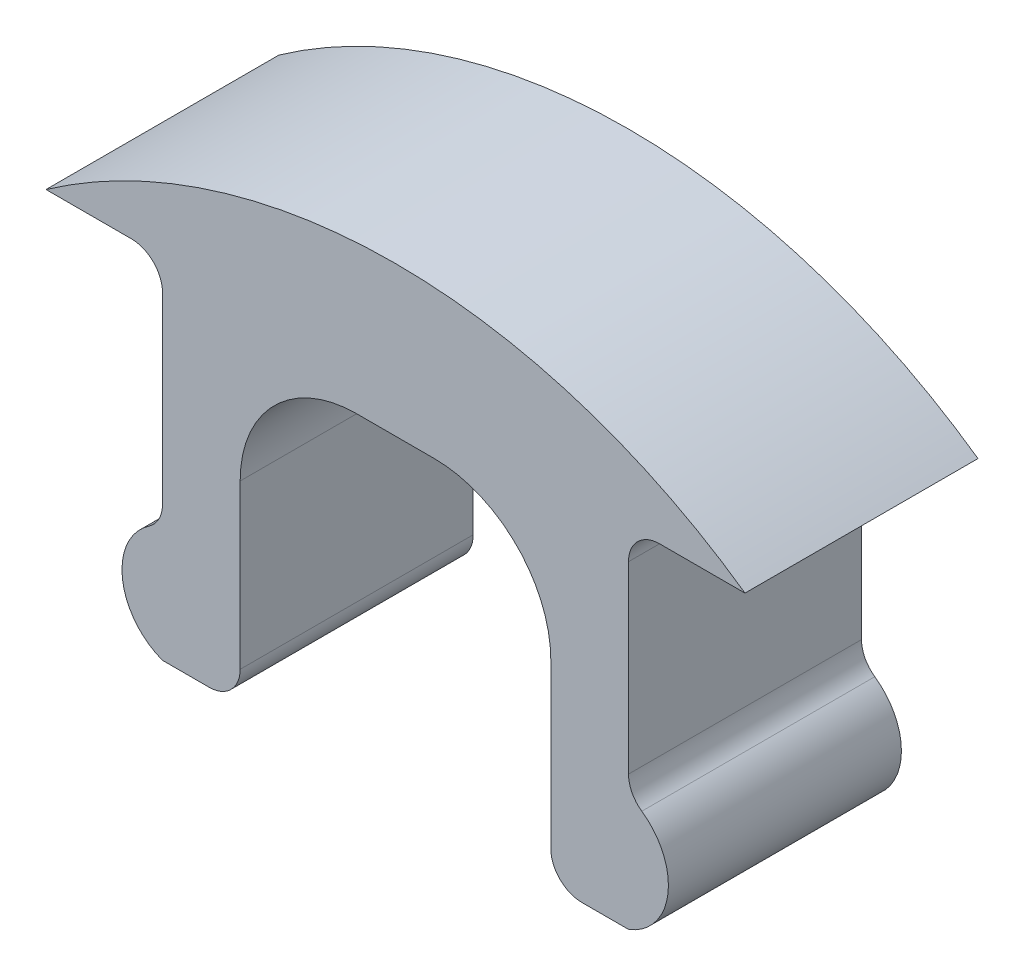
ISO-10303-21;
HEADER;
FILE_DESCRIPTION(('STEP AP214'),'2;1');
FILE_NAME('part.step','',(''),(''),'','','');
FILE_SCHEMA(('AUTOMOTIVE_DESIGN { 1 0 10303 214 1 1 1 1 }'));
ENDSEC;
DATA;
#1=APPLICATION_CONTEXT('core data for automotive mechanical design processes');
#2=APPLICATION_PROTOCOL_DEFINITION('international standard','automotive_design',2000,#1);
#3=PRODUCT_CONTEXT('',#1,'mechanical');
#4=PRODUCT('Part','Part','',(#3));
#5=PRODUCT_RELATED_PRODUCT_CATEGORY('part','',(#4));
#6=PRODUCT_DEFINITION_FORMATION('','',#4);
#7=PRODUCT_DEFINITION_CONTEXT('part definition',#1,'design');
#8=PRODUCT_DEFINITION('design','',#6,#7);
#9=PRODUCT_DEFINITION_SHAPE('','',#8);
#10=(LENGTH_UNIT() NAMED_UNIT(*) SI_UNIT(.MILLI.,.METRE.));
#11=(NAMED_UNIT(*) PLANE_ANGLE_UNIT() SI_UNIT($,.RADIAN.));
#12=(NAMED_UNIT(*) SI_UNIT($,.STERADIAN.) SOLID_ANGLE_UNIT());
#13=UNCERTAINTY_MEASURE_WITH_UNIT(LENGTH_MEASURE(1.E-05),#10,'distance_accuracy_value','');
#14=(GEOMETRIC_REPRESENTATION_CONTEXT(3) GLOBAL_UNCERTAINTY_ASSIGNED_CONTEXT((#13)) GLOBAL_UNIT_ASSIGNED_CONTEXT((#10,
#11,#12)) REPRESENTATION_CONTEXT('',''));
#15=CARTESIAN_POINT('',(0.,0.,0.));
#16=DIRECTION('',(0.,0.,1.));
#17=DIRECTION('',(1.,0.,0.));
#18=AXIS2_PLACEMENT_3D('',#15,#16,#17);
#19=CARTESIAN_POINT('',(0.278388218141501,-0.75,3.));
#20=DIRECTION('',(0.,0.,-1.));
#21=DIRECTION('',(-1.,0.,0.));
#22=AXIS2_PLACEMENT_3D('',#19,#20,#21);
#23=CYLINDRICAL_SURFACE('',#22,0.8);
#24=CARTESIAN_POINT('',(0.278388218141501,-0.75,3.));
#25=DIRECTION('',(0.,0.,1.));
#26=DIRECTION('',(-1.,0.,0.));
#27=AXIS2_PLACEMENT_3D('',#24,#25,#26);
#28=CIRCLE('',#27,0.8);
#29=CARTESIAN_POINT('',(-0.173870593952833,-0.0901045788285679,3.));
#30=VERTEX_POINT('',#29);
#31=CARTESIAN_POINT('',(0.,-1.5,3.));
#32=VERTEX_POINT('',#31);
#33=EDGE_CURVE('E177',#30,#32,#28,.T.);
#34=ORIENTED_EDGE('',*,*,#33,.F.);
#35=DIRECTION('',(0.,0.,-1.));
#36=VECTOR('',#35,1.);
#37=CARTESIAN_POINT('',(-0.173870593952833,-0.0901045788285678,3.));
#38=LINE('',#37,#36);
#39=CARTESIAN_POINT('',(-0.173870593952833,-0.0901045788285679,0.));
#40=VERTEX_POINT('',#39);
#41=EDGE_CURVE('E241',#30,#40,#38,.T.);
#42=ORIENTED_EDGE('',*,*,#41,.T.);
#43=CARTESIAN_POINT('',(0.278388218141501,-0.75,0.));
#44=DIRECTION('',(0.,0.,1.));
#45=DIRECTION('',(-1.,0.,0.));
#46=AXIS2_PLACEMENT_3D('',#43,#44,#45);
#47=CIRCLE('',#46,0.8);
#48=CARTESIAN_POINT('',(0.,-1.5,0.));
#49=VERTEX_POINT('',#48);
#50=EDGE_CURVE('E203',#40,#49,#47,.T.);
#51=ORIENTED_EDGE('',*,*,#50,.T.);
#52=DIRECTION('',(0.,0.,-1.));
#53=VECTOR('',#52,1.);
#54=CARTESIAN_POINT('',(0.,-1.5,3.));
#55=LINE('',#54,#53);
#56=EDGE_CURVE('E196',#32,#49,#55,.T.);
#57=ORIENTED_EDGE('',*,*,#56,.F.);
#58=EDGE_LOOP('',(#34,#42,#51,#57));
#59=FACE_BOUND('',#58,.T.);
#60=ADVANCED_FACE('F39',(#59),#23,.T.);
#61=CARTESIAN_POINT('',(0.,-1.5,3.));
#62=DIRECTION('',(0.,1.,0.));
#63=DIRECTION('',(0.,0.,1.));
#64=AXIS2_PLACEMENT_3D('',#61,#62,#63);
#65=PLANE('',#64);
#66=DIRECTION('',(1.,0.,0.));
#67=VECTOR('',#66,1.);
#68=CARTESIAN_POINT('',(0.,-1.5,0.));
#69=LINE('',#68,#67);
#70=CARTESIAN_POINT('',(0.6,-1.5,0.));
#71=VERTEX_POINT('',#70);
#72=EDGE_CURVE('E342',#49,#71,#69,.T.);
#73=ORIENTED_EDGE('',*,*,#72,.T.);
#74=DIRECTION('',(0.,0.,-1.));
#75=VECTOR('',#74,1.);
#76=CARTESIAN_POINT('',(0.6,-1.5,3.));
#77=LINE('',#76,#75);
#78=CARTESIAN_POINT('',(0.6,-1.5,3.));
#79=VERTEX_POINT('',#78);
#80=EDGE_CURVE('E198',#71,#79,#77,.F.);
#81=ORIENTED_EDGE('',*,*,#80,.T.);
#82=DIRECTION('',(1.,0.,0.));
#83=VECTOR('',#82,1.);
#84=CARTESIAN_POINT('',(0.,-1.5,3.));
#85=LINE('',#84,#83);
#86=EDGE_CURVE('E180',#32,#79,#85,.T.);
#87=ORIENTED_EDGE('',*,*,#86,.F.);
#88=ORIENTED_EDGE('',*,*,#56,.T.);
#89=EDGE_LOOP('',(#73,#81,#87,#88));
#90=FACE_BOUND('',#89,.T.);
#91=ADVANCED_FACE('F195',(#90),#65,.F.);
#92=CARTESIAN_POINT('',(1.,-1.5,3.));
#93=DIRECTION('',(-1.,0.,0.));
#94=DIRECTION('',(0.,0.,1.));
#95=AXIS2_PLACEMENT_3D('',#92,#93,#94);
#96=PLANE('',#95);
#97=DIRECTION('',(0.,1.,0.));
#98=VECTOR('',#97,1.);
#99=CARTESIAN_POINT('',(1.,-1.5,0.));
#100=LINE('',#99,#98);
#101=CARTESIAN_POINT('',(1.,-1.1,0.));
#102=VERTEX_POINT('',#101);
#103=CARTESIAN_POINT('',(1.,1.,0.));
#104=VERTEX_POINT('',#103);
#105=EDGE_CURVE('E336',#102,#104,#100,.T.);
#106=ORIENTED_EDGE('',*,*,#105,.T.);
#107=DIRECTION('',(0.,0.,-1.));
#108=VECTOR('',#107,1.);
#109=CARTESIAN_POINT('',(1.,1.,3.));
#110=LINE('',#109,#108);
#111=CARTESIAN_POINT('',(1.,1.,3.));
#112=VERTEX_POINT('',#111);
#113=EDGE_CURVE('E61',#104,#112,#110,.F.);
#114=ORIENTED_EDGE('',*,*,#113,.T.);
#115=DIRECTION('',(0.,1.,0.));
#116=VECTOR('',#115,1.);
#117=CARTESIAN_POINT('',(1.,-1.5,3.));
#118=LINE('',#117,#116);
#119=CARTESIAN_POINT('',(1.,-1.1,3.));
#120=VERTEX_POINT('',#119);
#121=EDGE_CURVE('E200',#120,#112,#118,.T.);
#122=ORIENTED_EDGE('',*,*,#121,.F.);
#123=DIRECTION('',(0.,0.,-1.));
#124=VECTOR('',#123,1.);
#125=CARTESIAN_POINT('',(1.,-1.1,3.));
#126=LINE('',#125,#124);
#127=EDGE_CURVE('E206',#120,#102,#126,.T.);
#128=ORIENTED_EDGE('',*,*,#127,.T.);
#129=EDGE_LOOP('',(#106,#114,#122,#128));
#130=FACE_BOUND('',#129,.T.);
#131=ADVANCED_FACE('F413',(#130),#96,.F.);
#132=CARTESIAN_POINT('',(1.,2.5,3.));
#133=DIRECTION('',(0.,1.,0.));
#134=DIRECTION('',(0.,0.,1.));
#135=AXIS2_PLACEMENT_3D('',#132,#133,#134);
#136=PLANE('',#135);
#137=DIRECTION('',(1.,0.,0.));
#138=VECTOR('',#137,1.);
#139=CARTESIAN_POINT('',(1.,2.5,0.));
#140=LINE('',#139,#138);
#141=CARTESIAN_POINT('',(2.5,2.5,0.));
#142=VERTEX_POINT('',#141);
#143=CARTESIAN_POINT('',(3.5,2.5,0.));
#144=VERTEX_POINT('',#143);
#145=EDGE_CURVE('E330',#142,#144,#140,.T.);
#146=ORIENTED_EDGE('',*,*,#145,.T.);
#147=DIRECTION('',(0.,0.,-1.));
#148=VECTOR('',#147,1.);
#149=CARTESIAN_POINT('',(3.5,2.5,3.));
#150=LINE('',#149,#148);
#151=CARTESIAN_POINT('',(3.5,2.5,3.));
#152=VERTEX_POINT('',#151);
#153=EDGE_CURVE('E299',#144,#152,#150,.F.);
#154=ORIENTED_EDGE('',*,*,#153,.T.);
#155=DIRECTION('',(1.,0.,0.));
#156=VECTOR('',#155,1.);
#157=CARTESIAN_POINT('',(1.,2.5,3.));
#158=LINE('',#157,#156);
#159=CARTESIAN_POINT('',(2.5,2.5,3.));
#160=VERTEX_POINT('',#159);
#161=EDGE_CURVE('E315',#160,#152,#158,.T.);
#162=ORIENTED_EDGE('',*,*,#161,.F.);
#163=DIRECTION('',(0.,0.,-1.));
#164=VECTOR('',#163,1.);
#165=CARTESIAN_POINT('',(2.5,2.5,0.));
#166=LINE('',#165,#164);
#167=EDGE_CURVE('E295',#160,#142,#166,.T.);
#168=ORIENTED_EDGE('',*,*,#167,.T.);
#169=EDGE_LOOP('',(#146,#154,#162,#168));
#170=FACE_BOUND('',#169,.T.);
#171=ADVANCED_FACE('F333',(#170),#136,.F.);
#172=CARTESIAN_POINT('',(5.,2.5,3.));
#173=DIRECTION('',(1.,0.,0.));
#174=DIRECTION('',(0.,0.,-1.));
#175=AXIS2_PLACEMENT_3D('',#172,#173,#174);
#176=PLANE('',#175);
#177=DIRECTION('',(0.,-1.,0.));
#178=VECTOR('',#177,1.);
#179=CARTESIAN_POINT('',(5.,2.5,3.));
#180=LINE('',#179,#178);
#181=CARTESIAN_POINT('',(5.,1.,3.));
#182=VERTEX_POINT('',#181);
#183=CARTESIAN_POINT('',(5.,-1.1,3.));
#184=VERTEX_POINT('',#183);
#185=EDGE_CURVE('E313',#182,#184,#180,.T.);
#186=ORIENTED_EDGE('',*,*,#185,.F.);
#187=DIRECTION('',(0.,0.,-1.));
#188=VECTOR('',#187,1.);
#189=CARTESIAN_POINT('',(5.,1.,0.));
#190=LINE('',#189,#188);
#191=CARTESIAN_POINT('',(5.,1.,0.));
#192=VERTEX_POINT('',#191);
#193=EDGE_CURVE('E291',#182,#192,#190,.T.);
#194=ORIENTED_EDGE('',*,*,#193,.T.);
#195=DIRECTION('',(0.,-1.,0.));
#196=VECTOR('',#195,1.);
#197=CARTESIAN_POINT('',(5.,2.5,0.));
#198=LINE('',#197,#196);
#199=CARTESIAN_POINT('',(5.,-1.1,0.));
#200=VERTEX_POINT('',#199);
#201=EDGE_CURVE('E331',#192,#200,#198,.T.);
#202=ORIENTED_EDGE('',*,*,#201,.T.);
#203=DIRECTION('',(0.,0.,-1.));
#204=VECTOR('',#203,1.);
#205=CARTESIAN_POINT('',(5.,-1.1,3.));
#206=LINE('',#205,#204);
#207=EDGE_CURVE('E237',#200,#184,#206,.F.);
#208=ORIENTED_EDGE('',*,*,#207,.T.);
#209=EDGE_LOOP('',(#186,#194,#202,#208));
#210=FACE_BOUND('',#209,.T.);
#211=ADVANCED_FACE('F320',(#210),#176,.F.);
#212=CARTESIAN_POINT('',(5.,-1.5,3.));
#213=DIRECTION('',(0.,1.,0.));
#214=DIRECTION('',(0.,0.,1.));
#215=AXIS2_PLACEMENT_3D('',#212,#213,#214);
#216=PLANE('',#215);
#217=DIRECTION('',(1.,0.,0.));
#218=VECTOR('',#217,1.);
#219=CARTESIAN_POINT('',(5.,-1.5,3.));
#220=LINE('',#219,#218);
#221=CARTESIAN_POINT('',(5.4,-1.5,3.));
#222=VERTEX_POINT('',#221);
#223=CARTESIAN_POINT('',(6.,-1.5,3.));
#224=VERTEX_POINT('',#223);
#225=EDGE_CURVE('E325',#222,#224,#220,.T.);
#226=ORIENTED_EDGE('',*,*,#225,.F.);
#227=DIRECTION('',(0.,0.,-1.));
#228=VECTOR('',#227,1.);
#229=CARTESIAN_POINT('',(5.4,-1.5,3.));
#230=LINE('',#229,#228);
#231=CARTESIAN_POINT('',(5.4,-1.5,0.));
#232=VERTEX_POINT('',#231);
#233=EDGE_CURVE('E233',#222,#232,#230,.T.);
#234=ORIENTED_EDGE('',*,*,#233,.T.);
#235=DIRECTION('',(1.,0.,0.));
#236=VECTOR('',#235,1.);
#237=CARTESIAN_POINT('',(5.,-1.5,0.));
#238=LINE('',#237,#236);
#239=CARTESIAN_POINT('',(6.,-1.5,0.));
#240=VERTEX_POINT('',#239);
#241=EDGE_CURVE('E340',#232,#240,#238,.T.);
#242=ORIENTED_EDGE('',*,*,#241,.T.);
#243=DIRECTION('',(0.,0.,-1.));
#244=VECTOR('',#243,1.);
#245=CARTESIAN_POINT('',(6.,-1.5,3.));
#246=LINE('',#245,#244);
#247=EDGE_CURVE('E207',#224,#240,#246,.T.);
#248=ORIENTED_EDGE('',*,*,#247,.F.);
#249=EDGE_LOOP('',(#226,#234,#242,#248));
#250=FACE_BOUND('',#249,.T.);
#251=ADVANCED_FACE('F455',(#250),#216,.F.);
#252=CARTESIAN_POINT('',(5.71378692896109,-0.75295108729985,3.));
#253=DIRECTION('',(0.,0.,-1.));
#254=DIRECTION('',(-1.,0.,0.));
#255=AXIS2_PLACEMENT_3D('',#252,#253,#254);
#256=CYLINDRICAL_SURFACE('',#255,0.8);
#257=CARTESIAN_POINT('',(5.71378692896109,-0.75295108729985,0.));
#258=DIRECTION('',(0.,0.,1.));
#259=DIRECTION('',(-1.,0.,0.));
#260=AXIS2_PLACEMENT_3D('',#257,#258,#259);
#261=CIRCLE('',#260,0.8);
#262=CARTESIAN_POINT('',(6.1712623096537,-0.0966613067454398,0.));
#263=VERTEX_POINT('',#262);
#264=EDGE_CURVE('E348',#240,#263,#261,.T.);
#265=ORIENTED_EDGE('',*,*,#264,.T.);
#266=DIRECTION('',(0.,0.,-1.));
#267=VECTOR('',#266,1.);
#268=CARTESIAN_POINT('',(6.1712623096537,-0.0966613067454398,3.));
#269=LINE('',#268,#267);
#270=CARTESIAN_POINT('',(6.1712623096537,-0.0966613067454398,3.));
#271=VERTEX_POINT('',#270);
#272=EDGE_CURVE('E258',#263,#271,#269,.F.);
#273=ORIENTED_EDGE('',*,*,#272,.T.);
#274=CARTESIAN_POINT('',(5.71378692896109,-0.75295108729985,3.));
#275=DIRECTION('',(0.,0.,1.));
#276=DIRECTION('',(-1.,0.,0.));
#277=AXIS2_PLACEMENT_3D('',#274,#275,#276);
#278=CIRCLE('',#277,0.8);
#279=EDGE_CURVE('E421',#224,#271,#278,.T.);
#280=ORIENTED_EDGE('',*,*,#279,.F.);
#281=ORIENTED_EDGE('',*,*,#247,.T.);
#282=EDGE_LOOP('',(#265,#273,#280,#281));
#283=FACE_BOUND('',#282,.T.);
#284=ADVANCED_FACE('F450',(#283),#256,.T.);
#285=CARTESIAN_POINT('',(6.,-0.00590217459969908,3.));
#286=DIRECTION('',(-1.,0.,0.));
#287=DIRECTION('',(0.,0.,1.));
#288=AXIS2_PLACEMENT_3D('',#285,#286,#287);
#289=PLANE('',#288);
#290=DIRECTION('',(0.,1.,0.));
#291=VECTOR('',#290,1.);
#292=CARTESIAN_POINT('',(6.,-0.00590217459969908,3.));
#293=LINE('',#292,#291);
#294=CARTESIAN_POINT('',(6.,0.231483583531765,3.));
#295=VERTEX_POINT('',#294);
#296=CARTESIAN_POINT('',(6.,2.6,3.));
#297=VERTEX_POINT('',#296);
#298=EDGE_CURVE('E425',#295,#297,#293,.T.);
#299=ORIENTED_EDGE('',*,*,#298,.F.);
#300=DIRECTION('',(0.,0.,1.));
#301=VECTOR('',#300,1.);
#302=CARTESIAN_POINT('',(6.,0.231483583531765,0.));
#303=LINE('',#302,#301);
#304=CARTESIAN_POINT('',(6.,0.231483583531765,0.));
#305=VERTEX_POINT('',#304);
#306=EDGE_CURVE('E254',#295,#305,#303,.F.);
#307=ORIENTED_EDGE('',*,*,#306,.T.);
#308=DIRECTION('',(0.,1.,0.));
#309=VECTOR('',#308,1.);
#310=CARTESIAN_POINT('',(6.,-0.00590217459969908,0.));
#311=LINE('',#310,#309);
#312=CARTESIAN_POINT('',(6.,2.6,0.));
#313=VERTEX_POINT('',#312);
#314=EDGE_CURVE('E352',#305,#313,#311,.T.);
#315=ORIENTED_EDGE('',*,*,#314,.T.);
#316=DIRECTION('',(0.,0.,-1.));
#317=VECTOR('',#316,1.);
#318=CARTESIAN_POINT('',(6.,2.6,3.));
#319=LINE('',#318,#317);
#320=EDGE_CURVE('E251',#313,#297,#319,.F.);
#321=ORIENTED_EDGE('',*,*,#320,.T.);
#322=EDGE_LOOP('',(#299,#307,#315,#321));
#323=FACE_BOUND('',#322,.T.);
#324=ADVANCED_FACE('F441',(#323),#289,.F.);
#325=CARTESIAN_POINT('',(6.,3.,3.));
#326=DIRECTION('',(0.,1.,0.));
#327=DIRECTION('',(0.,0.,1.));
#328=AXIS2_PLACEMENT_3D('',#325,#326,#327);
#329=PLANE('',#328);
#330=DIRECTION('',(1.,0.,0.));
#331=VECTOR('',#330,1.);
#332=CARTESIAN_POINT('',(6.,3.,3.));
#333=LINE('',#332,#331);
#334=CARTESIAN_POINT('',(6.4,3.,3.));
#335=VERTEX_POINT('',#334);
#336=CARTESIAN_POINT('',(7.5,3.,3.));
#337=VERTEX_POINT('',#336);
#338=EDGE_CURVE('E429',#335,#337,#333,.T.);
#339=ORIENTED_EDGE('',*,*,#338,.F.);
#340=DIRECTION('',(0.,0.,-1.));
#341=VECTOR('',#340,1.);
#342=CARTESIAN_POINT('',(6.4,3.,0.));
#343=LINE('',#342,#341);
#344=CARTESIAN_POINT('',(6.4,3.,0.));
#345=VERTEX_POINT('',#344);
#346=EDGE_CURVE('E261',#335,#345,#343,.T.);
#347=ORIENTED_EDGE('',*,*,#346,.T.);
#348=DIRECTION('',(1.,0.,0.));
#349=VECTOR('',#348,1.);
#350=CARTESIAN_POINT('',(6.,3.,0.));
#351=LINE('',#350,#349);
#352=CARTESIAN_POINT('',(7.5,3.,0.));
#353=VERTEX_POINT('',#352);
#354=EDGE_CURVE('E356',#345,#353,#351,.T.);
#355=ORIENTED_EDGE('',*,*,#354,.T.);
#356=DIRECTION('',(0.,0.,-1.));
#357=VECTOR('',#356,1.);
#358=CARTESIAN_POINT('',(7.5,3.,3.));
#359=LINE('',#358,#357);
#360=EDGE_CURVE('E215',#337,#353,#359,.T.);
#361=ORIENTED_EDGE('',*,*,#360,.F.);
#362=EDGE_LOOP('',(#339,#347,#355,#361));
#363=FACE_BOUND('',#362,.T.);
#364=ADVANCED_FACE('F434',(#363),#329,.F.);
#365=CARTESIAN_POINT('',(3.,-3.3916889074762,3.));
#366=DIRECTION('',(0.,0.,-1.));
#367=DIRECTION('',(-1.,0.,0.));
#368=AXIS2_PLACEMENT_3D('',#365,#366,#367);
#369=CYLINDRICAL_SURFACE('',#368,7.81688474329476);
#370=CARTESIAN_POINT('',(3.,-3.3916889074762,0.));
#371=DIRECTION('',(0.,0.,1.));
#372=DIRECTION('',(-1.,0.,0.));
#373=AXIS2_PLACEMENT_3D('',#370,#371,#372);
#374=CIRCLE('',#373,7.81688474329476);
#375=CARTESIAN_POINT('',(-1.5,3.,0.));
#376=VERTEX_POINT('',#375);
#377=EDGE_CURVE('E359',#353,#376,#374,.T.);
#378=ORIENTED_EDGE('',*,*,#377,.T.);
#379=DIRECTION('',(0.,0.,-1.));
#380=VECTOR('',#379,1.);
#381=CARTESIAN_POINT('',(-1.5,3.,3.));
#382=LINE('',#381,#380);
#383=CARTESIAN_POINT('',(-1.5,3.,3.));
#384=VERTEX_POINT('',#383);
#385=EDGE_CURVE('E369',#384,#376,#382,.T.);
#386=ORIENTED_EDGE('',*,*,#385,.F.);
#387=CARTESIAN_POINT('',(3.,-3.3916889074762,3.));
#388=DIRECTION('',(0.,0.,1.));
#389=DIRECTION('',(-1.,0.,0.));
#390=AXIS2_PLACEMENT_3D('',#387,#388,#389);
#391=CIRCLE('',#390,7.81688474329476);
#392=EDGE_CURVE('E381',#337,#384,#391,.T.);
#393=ORIENTED_EDGE('',*,*,#392,.F.);
#394=ORIENTED_EDGE('',*,*,#360,.T.);
#395=EDGE_LOOP('',(#378,#386,#393,#394));
#396=FACE_BOUND('',#395,.T.);
#397=ADVANCED_FACE('F379',(#396),#369,.T.);
#398=CARTESIAN_POINT('',(0.,3.,3.));
#399=DIRECTION('',(0.,1.,0.));
#400=DIRECTION('',(0.,0.,1.));
#401=AXIS2_PLACEMENT_3D('',#398,#399,#400);
#402=PLANE('',#401);
#403=DIRECTION('',(1.,0.,0.));
#404=VECTOR('',#403,1.);
#405=CARTESIAN_POINT('',(0.,3.,0.));
#406=LINE('',#405,#404);
#407=CARTESIAN_POINT('',(-0.4,3.,0.));
#408=VERTEX_POINT('',#407);
#409=EDGE_CURVE('E362',#376,#408,#406,.T.);
#410=ORIENTED_EDGE('',*,*,#409,.T.);
#411=DIRECTION('',(0.,0.,-1.));
#412=VECTOR('',#411,1.);
#413=CARTESIAN_POINT('',(-0.4,3.,3.));
#414=LINE('',#413,#412);
#415=CARTESIAN_POINT('',(-0.4,3.,3.));
#416=VERTEX_POINT('',#415);
#417=EDGE_CURVE('E265',#408,#416,#414,.F.);
#418=ORIENTED_EDGE('',*,*,#417,.T.);
#419=DIRECTION('',(1.,0.,0.));
#420=VECTOR('',#419,1.);
#421=CARTESIAN_POINT('',(0.,3.,3.));
#422=LINE('',#421,#420);
#423=EDGE_CURVE('E397',#384,#416,#422,.T.);
#424=ORIENTED_EDGE('',*,*,#423,.F.);
#425=ORIENTED_EDGE('',*,*,#385,.T.);
#426=EDGE_LOOP('',(#410,#418,#424,#425));
#427=FACE_BOUND('',#426,.T.);
#428=ADVANCED_FACE('F389',(#427),#402,.F.);
#429=CARTESIAN_POINT('',(0.,0.,3.));
#430=DIRECTION('',(1.,0.,0.));
#431=DIRECTION('',(0.,0.,-1.));
#432=AXIS2_PLACEMENT_3D('',#429,#430,#431);
#433=PLANE('',#432);
#434=DIRECTION('',(0.,-1.,0.));
#435=VECTOR('',#434,1.);
#436=CARTESIAN_POINT('',(0.,0.,0.));
#437=LINE('',#436,#435);
#438=CARTESIAN_POINT('',(0.,2.6,0.));
#439=VERTEX_POINT('',#438);
#440=CARTESIAN_POINT('',(0.,0.239843131757148,0.));
#441=VERTEX_POINT('',#440);
#442=EDGE_CURVE('E190',#439,#441,#437,.T.);
#443=ORIENTED_EDGE('',*,*,#442,.T.);
#444=DIRECTION('',(0.,0.,1.));
#445=VECTOR('',#444,1.);
#446=CARTESIAN_POINT('',(0.,0.239843131757148,3.));
#447=LINE('',#446,#445);
#448=CARTESIAN_POINT('',(0.,0.239843131757148,3.));
#449=VERTEX_POINT('',#448);
#450=EDGE_CURVE('E248',#441,#449,#447,.T.);
#451=ORIENTED_EDGE('',*,*,#450,.T.);
#452=DIRECTION('',(0.,-1.,0.));
#453=VECTOR('',#452,1.);
#454=CARTESIAN_POINT('',(0.,0.,3.));
#455=LINE('',#454,#453);
#456=CARTESIAN_POINT('',(0.,2.6,3.));
#457=VERTEX_POINT('',#456);
#458=EDGE_CURVE('E372',#457,#449,#455,.T.);
#459=ORIENTED_EDGE('',*,*,#458,.F.);
#460=DIRECTION('',(0.,0.,-1.));
#461=VECTOR('',#460,1.);
#462=CARTESIAN_POINT('',(0.,2.6,0.));
#463=LINE('',#462,#461);
#464=EDGE_CURVE('E244',#457,#439,#463,.T.);
#465=ORIENTED_EDGE('',*,*,#464,.T.);
#466=EDGE_LOOP('',(#443,#451,#459,#465));
#467=FACE_BOUND('',#466,.T.);
#468=ADVANCED_FACE('F399',(#467),#433,.F.);
#469=CARTESIAN_POINT('',(0.278388218141501,-0.75,3.));
#470=DIRECTION('',(0.,0.,-1.));
#471=DIRECTION('',(-1.,0.,0.));
#472=AXIS2_PLACEMENT_3D('',#469,#470,#471);
#473=PLANE('',#472);
#474=ORIENTED_EDGE('',*,*,#86,.T.);
#475=CARTESIAN_POINT('',(0.6,-1.1,3.));
#476=DIRECTION('',(0.,0.,-1.));
#477=DIRECTION('',(-1.,0.,0.));
#478=AXIS2_PLACEMENT_3D('',#475,#476,#477);
#479=CIRCLE('',#478,0.4);
#480=EDGE_CURVE('E230',#79,#120,#479,.F.);
#481=ORIENTED_EDGE('',*,*,#480,.T.);
#482=ORIENTED_EDGE('',*,*,#121,.T.);
#483=CARTESIAN_POINT('',(2.5,1.,3.));
#484=DIRECTION('',(0.,0.,-1.));
#485=DIRECTION('',(-1.,0.,0.));
#486=AXIS2_PLACEMENT_3D('',#483,#484,#485);
#487=CIRCLE('',#486,1.5);
#488=EDGE_CURVE('E11',#112,#160,#487,.T.);
#489=ORIENTED_EDGE('',*,*,#488,.T.);
#490=ORIENTED_EDGE('',*,*,#161,.T.);
#491=CARTESIAN_POINT('',(3.5,1.,3.));
#492=DIRECTION('',(0.,0.,-1.));
#493=DIRECTION('',(-1.,0.,0.));
#494=AXIS2_PLACEMENT_3D('',#491,#492,#493);
#495=CIRCLE('',#494,1.5);
#496=EDGE_CURVE('E307',#152,#182,#495,.T.);
#497=ORIENTED_EDGE('',*,*,#496,.T.);
#498=ORIENTED_EDGE('',*,*,#185,.T.);
#499=CARTESIAN_POINT('',(5.4,-1.1,3.));
#500=DIRECTION('',(0.,0.,-1.));
#501=DIRECTION('',(-1.,0.,0.));
#502=AXIS2_PLACEMENT_3D('',#499,#500,#501);
#503=CIRCLE('',#502,0.4);
#504=EDGE_CURVE('E227',#184,#222,#503,.F.);
#505=ORIENTED_EDGE('',*,*,#504,.T.);
#506=ORIENTED_EDGE('',*,*,#225,.T.);
#507=ORIENTED_EDGE('',*,*,#279,.T.);
#508=CARTESIAN_POINT('',(6.4,0.231483583531765,3.));
#509=DIRECTION('',(0.,0.,-1.));
#510=DIRECTION('',(-1.,0.,0.));
#511=AXIS2_PLACEMENT_3D('',#508,#509,#510);
#512=CIRCLE('',#511,0.4);
#513=EDGE_CURVE('E276',#271,#295,#512,.T.);
#514=ORIENTED_EDGE('',*,*,#513,.T.);
#515=ORIENTED_EDGE('',*,*,#298,.T.);
#516=CARTESIAN_POINT('',(6.4,2.6,3.));
#517=DIRECTION('',(0.,0.,-1.));
#518=DIRECTION('',(-1.,0.,0.));
#519=AXIS2_PLACEMENT_3D('',#516,#517,#518);
#520=CIRCLE('',#519,0.4);
#521=EDGE_CURVE('E282',#297,#335,#520,.T.);
#522=ORIENTED_EDGE('',*,*,#521,.T.);
#523=ORIENTED_EDGE('',*,*,#338,.T.);
#524=ORIENTED_EDGE('',*,*,#392,.T.);
#525=ORIENTED_EDGE('',*,*,#423,.T.);
#526=CARTESIAN_POINT('',(-0.4,2.6,3.));
#527=DIRECTION('',(0.,0.,-1.));
#528=DIRECTION('',(-1.,0.,0.));
#529=AXIS2_PLACEMENT_3D('',#526,#527,#528);
#530=CIRCLE('',#529,0.4);
#531=EDGE_CURVE('E288',#416,#457,#530,.T.);
#532=ORIENTED_EDGE('',*,*,#531,.T.);
#533=ORIENTED_EDGE('',*,*,#458,.T.);
#534=CARTESIAN_POINT('',(-0.4,0.239843131757148,3.));
#535=DIRECTION('',(0.,0.,-1.));
#536=DIRECTION('',(-1.,0.,0.));
#537=AXIS2_PLACEMENT_3D('',#534,#535,#536);
#538=CIRCLE('',#537,0.4);
#539=EDGE_CURVE('E184',#449,#30,#538,.T.);
#540=ORIENTED_EDGE('',*,*,#539,.T.);
#541=ORIENTED_EDGE('',*,*,#33,.T.);
#542=EDGE_LOOP('',(#474,#481,#482,#489,#490,#497,#498,#505,#506,#507,#514,#515,#522,#523,#524,
#525,#532,#533,#540,#541));
#543=FACE_BOUND('',#542,.T.);
#544=ADVANCED_FACE('F179',(#543),#473,.F.);
#545=CARTESIAN_POINT('',(0.278388218141501,-0.75,0.));
#546=DIRECTION('',(0.,0.,-1.));
#547=DIRECTION('',(-1.,0.,0.));
#548=AXIS2_PLACEMENT_3D('',#545,#546,#547);
#549=PLANE('',#548);
#550=ORIENTED_EDGE('',*,*,#105,.F.);
#551=CARTESIAN_POINT('',(0.6,-1.1,0.));
#552=DIRECTION('',(0.,0.,-1.));
#553=DIRECTION('',(-1.,0.,0.));
#554=AXIS2_PLACEMENT_3D('',#551,#552,#553);
#555=CIRCLE('',#554,0.4);
#556=EDGE_CURVE('E222',#102,#71,#555,.T.);
#557=ORIENTED_EDGE('',*,*,#556,.T.);
#558=ORIENTED_EDGE('',*,*,#72,.F.);
#559=ORIENTED_EDGE('',*,*,#50,.F.);
#560=CARTESIAN_POINT('',(-0.4,0.239843131757148,0.));
#561=DIRECTION('',(0.,0.,-1.));
#562=DIRECTION('',(-1.,0.,0.));
#563=AXIS2_PLACEMENT_3D('',#560,#561,#562);
#564=CIRCLE('',#563,0.4);
#565=EDGE_CURVE('E268',#40,#441,#564,.F.);
#566=ORIENTED_EDGE('',*,*,#565,.T.);
#567=ORIENTED_EDGE('',*,*,#442,.F.);
#568=CARTESIAN_POINT('',(-0.4,2.6,0.));
#569=DIRECTION('',(0.,0.,-1.));
#570=DIRECTION('',(-1.,0.,0.));
#571=AXIS2_PLACEMENT_3D('',#568,#569,#570);
#572=CIRCLE('',#571,0.4);
#573=EDGE_CURVE('E285',#439,#408,#572,.F.);
#574=ORIENTED_EDGE('',*,*,#573,.T.);
#575=ORIENTED_EDGE('',*,*,#409,.F.);
#576=ORIENTED_EDGE('',*,*,#377,.F.);
#577=ORIENTED_EDGE('',*,*,#354,.F.);
#578=CARTESIAN_POINT('',(6.4,2.6,0.));
#579=DIRECTION('',(0.,0.,-1.));
#580=DIRECTION('',(-1.,0.,0.));
#581=AXIS2_PLACEMENT_3D('',#578,#579,#580);
#582=CIRCLE('',#581,0.4);
#583=EDGE_CURVE('E279',#345,#313,#582,.F.);
#584=ORIENTED_EDGE('',*,*,#583,.T.);
#585=ORIENTED_EDGE('',*,*,#314,.F.);
#586=CARTESIAN_POINT('',(6.4,0.231483583531765,0.));
#587=DIRECTION('',(0.,0.,-1.));
#588=DIRECTION('',(-1.,0.,0.));
#589=AXIS2_PLACEMENT_3D('',#586,#587,#588);
#590=CIRCLE('',#589,0.4);
#591=EDGE_CURVE('E273',#305,#263,#590,.F.);
#592=ORIENTED_EDGE('',*,*,#591,.T.);
#593=ORIENTED_EDGE('',*,*,#264,.F.);
#594=ORIENTED_EDGE('',*,*,#241,.F.);
#595=CARTESIAN_POINT('',(5.4,-1.1,0.));
#596=DIRECTION('',(0.,0.,-1.));
#597=DIRECTION('',(-1.,0.,0.));
#598=AXIS2_PLACEMENT_3D('',#595,#596,#597);
#599=CIRCLE('',#598,0.4);
#600=EDGE_CURVE('E212',#232,#200,#599,.T.);
#601=ORIENTED_EDGE('',*,*,#600,.T.);
#602=ORIENTED_EDGE('',*,*,#201,.F.);
#603=CARTESIAN_POINT('',(3.5,1.,0.));
#604=DIRECTION('',(0.,0.,-1.));
#605=DIRECTION('',(-1.,0.,0.));
#606=AXIS2_PLACEMENT_3D('',#603,#604,#605);
#607=CIRCLE('',#606,1.5);
#608=EDGE_CURVE('E304',#192,#144,#607,.F.);
#609=ORIENTED_EDGE('',*,*,#608,.T.);
#610=ORIENTED_EDGE('',*,*,#145,.F.);
#611=CARTESIAN_POINT('',(2.5,1.,0.));
#612=DIRECTION('',(0.,0.,-1.));
#613=DIRECTION('',(-1.,0.,0.));
#614=AXIS2_PLACEMENT_3D('',#611,#612,#613);
#615=CIRCLE('',#614,1.5);
#616=EDGE_CURVE('E48',#142,#104,#615,.F.);
#617=ORIENTED_EDGE('',*,*,#616,.T.);
#618=EDGE_LOOP('',(#550,#557,#558,#559,#566,#567,#574,#575,#576,#577,#584,#585,#592,#593,#594,
#601,#602,#609,#610,#617));
#619=FACE_BOUND('',#618,.T.);
#620=ADVANCED_FACE('F329',(#619),#549,.T.);
#621=CARTESIAN_POINT('',(0.6,-1.1,3.));
#622=DIRECTION('',(0.,0.,-1.));
#623=DIRECTION('',(-1.,0.,0.));
#624=AXIS2_PLACEMENT_3D('',#621,#622,#623);
#625=CYLINDRICAL_SURFACE('',#624,0.4);
#626=ORIENTED_EDGE('',*,*,#480,.F.);
#627=ORIENTED_EDGE('',*,*,#80,.F.);
#628=ORIENTED_EDGE('',*,*,#556,.F.);
#629=ORIENTED_EDGE('',*,*,#127,.F.);
#630=EDGE_LOOP('',(#626,#627,#628,#629));
#631=FACE_BOUND('',#630,.T.);
#632=ADVANCED_FACE('F410',(#631),#625,.T.);
#633=CARTESIAN_POINT('',(5.4,-1.1,3.));
#634=DIRECTION('',(0.,0.,-1.));
#635=DIRECTION('',(-1.,0.,0.));
#636=AXIS2_PLACEMENT_3D('',#633,#634,#635);
#637=CYLINDRICAL_SURFACE('',#636,0.4);
#638=ORIENTED_EDGE('',*,*,#504,.F.);
#639=ORIENTED_EDGE('',*,*,#207,.F.);
#640=ORIENTED_EDGE('',*,*,#600,.F.);
#641=ORIENTED_EDGE('',*,*,#233,.F.);
#642=EDGE_LOOP('',(#638,#639,#640,#641));
#643=FACE_BOUND('',#642,.T.);
#644=ADVANCED_FACE('F458',(#643),#637,.T.);
#645=CARTESIAN_POINT('',(-0.4,0.239843131757148,3.));
#646=DIRECTION('',(0.,0.,-1.));
#647=DIRECTION('',(-1.,0.,0.));
#648=AXIS2_PLACEMENT_3D('',#645,#646,#647);
#649=CYLINDRICAL_SURFACE('',#648,0.4);
#650=ORIENTED_EDGE('',*,*,#539,.F.);
#651=ORIENTED_EDGE('',*,*,#450,.F.);
#652=ORIENTED_EDGE('',*,*,#565,.F.);
#653=ORIENTED_EDGE('',*,*,#41,.F.);
#654=EDGE_LOOP('',(#650,#651,#652,#653));
#655=FACE_BOUND('',#654,.T.);
#656=ADVANCED_FACE('F460',(#655),#649,.F.);
#657=CARTESIAN_POINT('',(6.4,0.231483583531765,3.));
#658=DIRECTION('',(0.,0.,-1.));
#659=DIRECTION('',(-1.,0.,0.));
#660=AXIS2_PLACEMENT_3D('',#657,#658,#659);
#661=CYLINDRICAL_SURFACE('',#660,0.4);
#662=ORIENTED_EDGE('',*,*,#513,.F.);
#663=ORIENTED_EDGE('',*,*,#272,.F.);
#664=ORIENTED_EDGE('',*,*,#591,.F.);
#665=ORIENTED_EDGE('',*,*,#306,.F.);
#666=EDGE_LOOP('',(#662,#663,#664,#665));
#667=FACE_BOUND('',#666,.T.);
#668=ADVANCED_FACE('F445',(#667),#661,.F.);
#669=CARTESIAN_POINT('',(6.4,2.6,3.));
#670=DIRECTION('',(0.,0.,1.));
#671=DIRECTION('',(1.,0.,0.));
#672=AXIS2_PLACEMENT_3D('',#669,#670,#671);
#673=CYLINDRICAL_SURFACE('',#672,0.4);
#674=ORIENTED_EDGE('',*,*,#521,.F.);
#675=ORIENTED_EDGE('',*,*,#320,.F.);
#676=ORIENTED_EDGE('',*,*,#583,.F.);
#677=ORIENTED_EDGE('',*,*,#346,.F.);
#678=EDGE_LOOP('',(#674,#675,#676,#677));
#679=FACE_BOUND('',#678,.T.);
#680=ADVANCED_FACE('F436',(#679),#673,.F.);
#681=CARTESIAN_POINT('',(-0.4,2.6,3.));
#682=DIRECTION('',(0.,0.,1.));
#683=DIRECTION('',(1.,0.,0.));
#684=AXIS2_PLACEMENT_3D('',#681,#682,#683);
#685=CYLINDRICAL_SURFACE('',#684,0.4);
#686=ORIENTED_EDGE('',*,*,#531,.F.);
#687=ORIENTED_EDGE('',*,*,#417,.F.);
#688=ORIENTED_EDGE('',*,*,#573,.F.);
#689=ORIENTED_EDGE('',*,*,#464,.F.);
#690=EDGE_LOOP('',(#686,#687,#688,#689));
#691=FACE_BOUND('',#690,.T.);
#692=ADVANCED_FACE('F394',(#691),#685,.F.);
#693=CARTESIAN_POINT('',(3.5,1.,3.));
#694=DIRECTION('',(0.,0.,1.));
#695=DIRECTION('',(1.,0.,0.));
#696=AXIS2_PLACEMENT_3D('',#693,#694,#695);
#697=CYLINDRICAL_SURFACE('',#696,1.5);
#698=ORIENTED_EDGE('',*,*,#496,.F.);
#699=ORIENTED_EDGE('',*,*,#153,.F.);
#700=ORIENTED_EDGE('',*,*,#608,.F.);
#701=ORIENTED_EDGE('',*,*,#193,.F.);
#702=EDGE_LOOP('',(#698,#699,#700,#701));
#703=FACE_BOUND('',#702,.T.);
#704=ADVANCED_FACE('F327',(#703),#697,.F.);
#705=CARTESIAN_POINT('',(2.5,1.,3.));
#706=DIRECTION('',(0.,0.,1.));
#707=DIRECTION('',(1.,0.,0.));
#708=AXIS2_PLACEMENT_3D('',#705,#706,#707);
#709=CYLINDRICAL_SURFACE('',#708,1.5);
#710=ORIENTED_EDGE('',*,*,#488,.F.);
#711=ORIENTED_EDGE('',*,*,#113,.F.);
#712=ORIENTED_EDGE('',*,*,#616,.F.);
#713=ORIENTED_EDGE('',*,*,#167,.F.);
#714=EDGE_LOOP('',(#710,#711,#712,#713));
#715=FACE_BOUND('',#714,.T.);
#716=ADVANCED_FACE('F41',(#715),#709,.F.);
#717=CLOSED_SHELL('',(#60,#91,#131,#171,#211,#251,#284,#324,#364,#397,#428,#468,#544,#620,#632,
#644,#656,#668,#680,#692,#704,#716));
#718=MANIFOLD_SOLID_BREP('B2',#717);
#719=ADVANCED_BREP_SHAPE_REPRESENTATION('',(#18,#718),#14);
#720=SHAPE_DEFINITION_REPRESENTATION(#9,#719);
ENDSEC;
END-ISO-10303-21;
